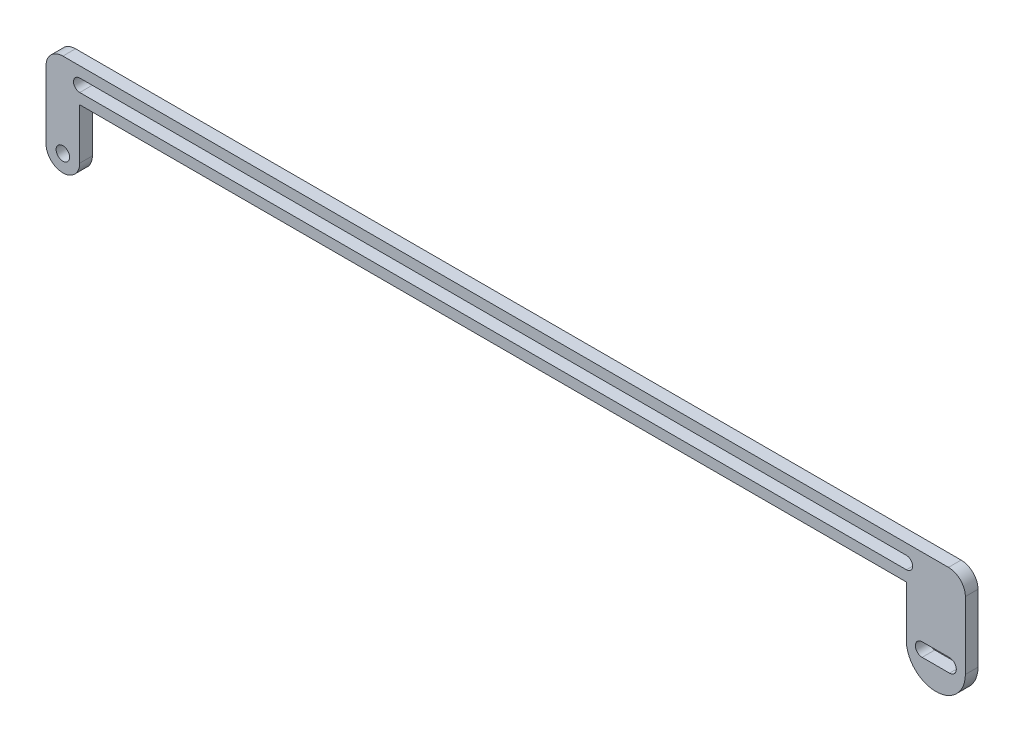
ISO-10303-21;
HEADER;
FILE_DESCRIPTION(('STEP AP214'),'2;1');
FILE_NAME('part.step','',(''),(''),'','','');
FILE_SCHEMA(('AUTOMOTIVE_DESIGN { 1 0 10303 214 1 1 1 1 }'));
ENDSEC;
DATA;
#1=APPLICATION_CONTEXT('core data for automotive mechanical design processes');
#2=APPLICATION_PROTOCOL_DEFINITION('international standard','automotive_design',2000,#1);
#3=PRODUCT_CONTEXT('',#1,'mechanical');
#4=PRODUCT('Part','Part','',(#3));
#5=PRODUCT_RELATED_PRODUCT_CATEGORY('part','',(#4));
#6=PRODUCT_DEFINITION_FORMATION('','',#4);
#7=PRODUCT_DEFINITION_CONTEXT('part definition',#1,'design');
#8=PRODUCT_DEFINITION('design','',#6,#7);
#9=PRODUCT_DEFINITION_SHAPE('','',#8);
#10=(LENGTH_UNIT() NAMED_UNIT(*) SI_UNIT(.MILLI.,.METRE.));
#11=(NAMED_UNIT(*) PLANE_ANGLE_UNIT() SI_UNIT($,.RADIAN.));
#12=(NAMED_UNIT(*) SI_UNIT($,.STERADIAN.) SOLID_ANGLE_UNIT());
#13=UNCERTAINTY_MEASURE_WITH_UNIT(LENGTH_MEASURE(1.E-05),#10,'distance_accuracy_value','');
#14=(GEOMETRIC_REPRESENTATION_CONTEXT(3) GLOBAL_UNCERTAINTY_ASSIGNED_CONTEXT((#13)) GLOBAL_UNIT_ASSIGNED_CONTEXT((#10,
#11,#12)) REPRESENTATION_CONTEXT('',''));
#15=CARTESIAN_POINT('',(0.,0.,0.));
#16=DIRECTION('',(0.,0.,1.));
#17=DIRECTION('',(1.,0.,0.));
#18=AXIS2_PLACEMENT_3D('',#15,#16,#17);
#19=CARTESIAN_POINT('',(-57.8502428277937,0.,3.));
#20=DIRECTION('',(1.,0.,0.));
#21=DIRECTION('',(0.,0.,-1.));
#22=AXIS2_PLACEMENT_3D('',#19,#20,#21);
#23=PLANE('',#22);
#24=DIRECTION('',(0.,-1.,0.));
#25=VECTOR('',#24,1.);
#26=CARTESIAN_POINT('',(-57.8502428277937,0.,0.));
#27=LINE('',#26,#25);
#28=CARTESIAN_POINT('',(-57.8502428277937,0.,0.));
#29=VERTEX_POINT('',#28);
#30=CARTESIAN_POINT('',(-57.8502428277937,-16.,0.));
#31=VERTEX_POINT('',#30);
#32=EDGE_CURVE('E220',#29,#31,#27,.T.);
#33=ORIENTED_EDGE('',*,*,#32,.T.);
#34=DIRECTION('',(0.,0.,-1.));
#35=VECTOR('',#34,1.);
#36=CARTESIAN_POINT('',(-57.8502428277937,-16.,3.));
#37=LINE('',#36,#35);
#38=CARTESIAN_POINT('',(-57.8502428277937,-16.,3.));
#39=VERTEX_POINT('',#38);
#40=EDGE_CURVE('E11',#39,#31,#37,.T.);
#41=ORIENTED_EDGE('',*,*,#40,.F.);
#42=DIRECTION('',(0.,-1.,0.));
#43=VECTOR('',#42,1.);
#44=CARTESIAN_POINT('',(-57.8502428277937,0.,3.));
#45=LINE('',#44,#43);
#46=CARTESIAN_POINT('',(-57.8502428277937,0.,3.));
#47=VERTEX_POINT('',#46);
#48=EDGE_CURVE('E382',#47,#39,#45,.T.);
#49=ORIENTED_EDGE('',*,*,#48,.F.);
#50=DIRECTION('',(0.,0.,-1.));
#51=VECTOR('',#50,1.);
#52=CARTESIAN_POINT('',(-57.8502428277937,0.,3.));
#53=LINE('',#52,#51);
#54=EDGE_CURVE('E246',#47,#29,#53,.T.);
#55=ORIENTED_EDGE('',*,*,#54,.T.);
#56=EDGE_LOOP('',(#33,#41,#49,#55));
#57=FACE_BOUND('',#56,.T.);
#58=ADVANCED_FACE('F35',(#57),#23,.F.);
#59=CARTESIAN_POINT('',(-53.8502428277937,-16.,3.));
#60=DIRECTION('',(0.,0.,-1.));
#61=DIRECTION('',(-1.,0.,0.));
#62=AXIS2_PLACEMENT_3D('',#59,#60,#61);
#63=CYLINDRICAL_SURFACE('',#62,4.);
#64=CARTESIAN_POINT('',(-53.8502428277937,-16.,0.));
#65=DIRECTION('',(0.,0.,1.));
#66=DIRECTION('',(1.,0.,0.));
#67=AXIS2_PLACEMENT_3D('',#64,#65,#66);
#68=CIRCLE('',#67,4.);
#69=CARTESIAN_POINT('',(-49.8502428277937,-16.,0.));
#70=VERTEX_POINT('',#69);
#71=EDGE_CURVE('E223',#31,#70,#68,.T.);
#72=ORIENTED_EDGE('',*,*,#71,.T.);
#73=DIRECTION('',(0.,0.,-1.));
#74=VECTOR('',#73,1.);
#75=CARTESIAN_POINT('',(-49.8502428277937,-16.,3.));
#76=LINE('',#75,#74);
#77=CARTESIAN_POINT('',(-49.8502428277937,-16.,3.));
#78=VERTEX_POINT('',#77);
#79=EDGE_CURVE('E45',#78,#70,#76,.T.);
#80=ORIENTED_EDGE('',*,*,#79,.F.);
#81=CARTESIAN_POINT('',(-53.8502428277937,-16.,3.));
#82=DIRECTION('',(0.,0.,1.));
#83=DIRECTION('',(1.,0.,0.));
#84=AXIS2_PLACEMENT_3D('',#81,#82,#83);
#85=CIRCLE('',#84,4.);
#86=EDGE_CURVE('E380',#39,#78,#85,.T.);
#87=ORIENTED_EDGE('',*,*,#86,.F.);
#88=ORIENTED_EDGE('',*,*,#40,.T.);
#89=EDGE_LOOP('',(#72,#80,#87,#88));
#90=FACE_BOUND('',#89,.T.);
#91=ADVANCED_FACE('F303',(#90),#63,.T.);
#92=CARTESIAN_POINT('',(-49.8502428277937,0.,3.));
#93=DIRECTION('',(1.,0.,0.));
#94=DIRECTION('',(0.,0.,-1.));
#95=AXIS2_PLACEMENT_3D('',#92,#93,#94);
#96=PLANE('',#95);
#97=DIRECTION('',(0.,-1.,0.));
#98=VECTOR('',#97,1.);
#99=CARTESIAN_POINT('',(-49.8502428277937,0.,0.));
#100=LINE('',#99,#98);
#101=CARTESIAN_POINT('',(-49.8502428277937,-4.,0.));
#102=VERTEX_POINT('',#101);
#103=EDGE_CURVE('E226',#102,#70,#100,.T.);
#104=ORIENTED_EDGE('',*,*,#103,.F.);
#105=DIRECTION('',(0.,0.,-1.));
#106=VECTOR('',#105,1.);
#107=CARTESIAN_POINT('',(-49.8502428277937,-4.,3.));
#108=LINE('',#107,#106);
#109=CARTESIAN_POINT('',(-49.8502428277937,-4.,3.));
#110=VERTEX_POINT('',#109);
#111=EDGE_CURVE('E257',#110,#102,#108,.T.);
#112=ORIENTED_EDGE('',*,*,#111,.F.);
#113=DIRECTION('',(0.,-1.,0.));
#114=VECTOR('',#113,1.);
#115=CARTESIAN_POINT('',(-49.8502428277937,0.,3.));
#116=LINE('',#115,#114);
#117=EDGE_CURVE('E378',#110,#78,#116,.T.);
#118=ORIENTED_EDGE('',*,*,#117,.T.);
#119=ORIENTED_EDGE('',*,*,#79,.T.);
#120=EDGE_LOOP('',(#104,#112,#118,#119));
#121=FACE_BOUND('',#120,.T.);
#122=ADVANCED_FACE('F309',(#121),#96,.T.);
#123=CARTESIAN_POINT('',(0.,-4.,3.));
#124=DIRECTION('',(0.,1.,0.));
#125=DIRECTION('',(0.,0.,1.));
#126=AXIS2_PLACEMENT_3D('',#123,#124,#125);
#127=PLANE('',#126);
#128=DIRECTION('',(1.,0.,0.));
#129=VECTOR('',#128,1.);
#130=CARTESIAN_POINT('',(0.,-4.,0.));
#131=LINE('',#130,#129);
#132=CARTESIAN_POINT('',(146.173644011722,-4.,0.));
#133=VERTEX_POINT('',#132);
#134=EDGE_CURVE('E229',#102,#133,#131,.T.);
#135=ORIENTED_EDGE('',*,*,#134,.T.);
#136=DIRECTION('',(0.,0.,-1.));
#137=VECTOR('',#136,1.);
#138=CARTESIAN_POINT('',(146.173644011722,-4.,3.));
#139=LINE('',#138,#137);
#140=CARTESIAN_POINT('',(146.173644011722,-4.,3.));
#141=VERTEX_POINT('',#140);
#142=EDGE_CURVE('E255',#141,#133,#139,.T.);
#143=ORIENTED_EDGE('',*,*,#142,.F.);
#144=DIRECTION('',(1.,0.,0.));
#145=VECTOR('',#144,1.);
#146=CARTESIAN_POINT('',(0.,-4.,3.));
#147=LINE('',#146,#145);
#148=EDGE_CURVE('E374',#110,#141,#147,.T.);
#149=ORIENTED_EDGE('',*,*,#148,.F.);
#150=ORIENTED_EDGE('',*,*,#111,.T.);
#151=EDGE_LOOP('',(#135,#143,#149,#150));
#152=FACE_BOUND('',#151,.T.);
#153=ADVANCED_FACE('F356',(#152),#127,.F.);
#154=CARTESIAN_POINT('',(146.173644011722,0.,3.));
#155=DIRECTION('',(-1.,0.,0.));
#156=DIRECTION('',(0.,0.,1.));
#157=AXIS2_PLACEMENT_3D('',#154,#155,#156);
#158=PLANE('',#157);
#159=DIRECTION('',(0.,1.,0.));
#160=VECTOR('',#159,1.);
#161=CARTESIAN_POINT('',(146.173644011722,0.,0.));
#162=LINE('',#161,#160);
#163=CARTESIAN_POINT('',(146.173644011722,-15.4960811467464,0.));
#164=VERTEX_POINT('',#163);
#165=EDGE_CURVE('E232',#164,#133,#162,.T.);
#166=ORIENTED_EDGE('',*,*,#165,.F.);
#167=DIRECTION('',(0.,0.,-1.));
#168=VECTOR('',#167,1.);
#169=CARTESIAN_POINT('',(146.173644011722,-15.4960811467464,3.));
#170=LINE('',#169,#168);
#171=CARTESIAN_POINT('',(146.173644011722,-15.4960811467464,3.));
#172=VERTEX_POINT('',#171);
#173=EDGE_CURVE('E253',#172,#164,#170,.T.);
#174=ORIENTED_EDGE('',*,*,#173,.F.);
#175=DIRECTION('',(0.,1.,0.));
#176=VECTOR('',#175,1.);
#177=CARTESIAN_POINT('',(146.173644011722,0.,3.));
#178=LINE('',#177,#176);
#179=EDGE_CURVE('E377',#172,#141,#178,.T.);
#180=ORIENTED_EDGE('',*,*,#179,.T.);
#181=ORIENTED_EDGE('',*,*,#142,.T.);
#182=EDGE_LOOP('',(#166,#174,#180,#181));
#183=FACE_BOUND('',#182,.T.);
#184=ADVANCED_FACE('F352',(#183),#158,.T.);
#185=CARTESIAN_POINT('',(153.152616012877,-16.,3.));
#186=DIRECTION('',(0.,0.,-1.));
#187=DIRECTION('',(-1.,0.,0.));
#188=AXIS2_PLACEMENT_3D('',#185,#186,#187);
#189=CYLINDRICAL_SURFACE('',#188,6.99714115932896);
#190=CARTESIAN_POINT('',(153.152616012877,-16.,0.));
#191=DIRECTION('',(0.,0.,1.));
#192=DIRECTION('',(1.,0.,0.));
#193=AXIS2_PLACEMENT_3D('',#190,#191,#192);
#194=CIRCLE('',#193,6.99714115932896);
#195=CARTESIAN_POINT('',(160.149757172206,-16.,0.));
#196=VERTEX_POINT('',#195);
#197=EDGE_CURVE('E235',#196,#164,#194,.F.);
#198=ORIENTED_EDGE('',*,*,#197,.F.);
#199=DIRECTION('',(0.,0.,-1.));
#200=VECTOR('',#199,1.);
#201=CARTESIAN_POINT('',(160.149757172206,-16.,3.));
#202=LINE('',#201,#200);
#203=CARTESIAN_POINT('',(160.149757172206,-16.,3.));
#204=VERTEX_POINT('',#203);
#205=EDGE_CURVE('E251',#204,#196,#202,.T.);
#206=ORIENTED_EDGE('',*,*,#205,.F.);
#207=CARTESIAN_POINT('',(153.152616012877,-16.,3.));
#208=DIRECTION('',(0.,0.,1.));
#209=DIRECTION('',(1.,0.,0.));
#210=AXIS2_PLACEMENT_3D('',#207,#208,#209);
#211=CIRCLE('',#210,6.99714115932896);
#212=EDGE_CURVE('E387',#204,#172,#211,.F.);
#213=ORIENTED_EDGE('',*,*,#212,.T.);
#214=ORIENTED_EDGE('',*,*,#173,.T.);
#215=EDGE_LOOP('',(#198,#206,#213,#214));
#216=FACE_BOUND('',#215,.T.);
#217=ADVANCED_FACE('F348',(#216),#189,.T.);
#218=CARTESIAN_POINT('',(160.149757172206,0.,3.));
#219=DIRECTION('',(1.,0.,0.));
#220=DIRECTION('',(0.,0.,-1.));
#221=AXIS2_PLACEMENT_3D('',#218,#219,#220);
#222=PLANE('',#221);
#223=DIRECTION('',(0.,-1.,0.));
#224=VECTOR('',#223,1.);
#225=CARTESIAN_POINT('',(160.149757172206,0.,0.));
#226=LINE('',#225,#224);
#227=CARTESIAN_POINT('',(160.149757172206,0.,0.));
#228=VERTEX_POINT('',#227);
#229=EDGE_CURVE('E238',#228,#196,#226,.T.);
#230=ORIENTED_EDGE('',*,*,#229,.F.);
#231=DIRECTION('',(0.,0.,-1.));
#232=VECTOR('',#231,1.);
#233=CARTESIAN_POINT('',(160.149757172206,0.,3.));
#234=LINE('',#233,#232);
#235=CARTESIAN_POINT('',(160.149757172206,0.,3.));
#236=VERTEX_POINT('',#235);
#237=EDGE_CURVE('E179',#236,#228,#234,.T.);
#238=ORIENTED_EDGE('',*,*,#237,.F.);
#239=DIRECTION('',(0.,-1.,0.));
#240=VECTOR('',#239,1.);
#241=CARTESIAN_POINT('',(160.149757172206,0.,3.));
#242=LINE('',#241,#240);
#243=EDGE_CURVE('E186',#236,#204,#242,.T.);
#244=ORIENTED_EDGE('',*,*,#243,.T.);
#245=ORIENTED_EDGE('',*,*,#205,.T.);
#246=EDGE_LOOP('',(#230,#238,#244,#245));
#247=FACE_BOUND('',#246,.T.);
#248=ADVANCED_FACE('F345',(#247),#222,.T.);
#249=CARTESIAN_POINT('',(156.149757172206,0.,3.));
#250=DIRECTION('',(0.,0.,-1.));
#251=DIRECTION('',(-1.,0.,0.));
#252=AXIS2_PLACEMENT_3D('',#249,#250,#251);
#253=CYLINDRICAL_SURFACE('',#252,4.);
#254=CARTESIAN_POINT('',(156.149757172206,0.,0.));
#255=DIRECTION('',(0.,0.,1.));
#256=DIRECTION('',(1.,0.,0.));
#257=AXIS2_PLACEMENT_3D('',#254,#255,#256);
#258=CIRCLE('',#257,4.);
#259=CARTESIAN_POINT('',(156.149757172206,4.,0.));
#260=VERTEX_POINT('',#259);
#261=EDGE_CURVE('E174',#260,#228,#258,.F.);
#262=ORIENTED_EDGE('',*,*,#261,.F.);
#263=DIRECTION('',(0.,0.,-1.));
#264=VECTOR('',#263,1.);
#265=CARTESIAN_POINT('',(156.149757172206,4.,3.));
#266=LINE('',#265,#264);
#267=CARTESIAN_POINT('',(156.149757172206,4.,3.));
#268=VERTEX_POINT('',#267);
#269=EDGE_CURVE('E169',#268,#260,#266,.T.);
#270=ORIENTED_EDGE('',*,*,#269,.F.);
#271=CARTESIAN_POINT('',(156.149757172206,0.,3.));
#272=DIRECTION('',(0.,0.,1.));
#273=DIRECTION('',(1.,0.,0.));
#274=AXIS2_PLACEMENT_3D('',#271,#272,#273);
#275=CIRCLE('',#274,4.);
#276=EDGE_CURVE('E172',#268,#236,#275,.F.);
#277=ORIENTED_EDGE('',*,*,#276,.T.);
#278=ORIENTED_EDGE('',*,*,#237,.T.);
#279=EDGE_LOOP('',(#262,#270,#277,#278));
#280=FACE_BOUND('',#279,.T.);
#281=ADVANCED_FACE('F171',(#280),#253,.T.);
#282=CARTESIAN_POINT('',(0.,4.,3.));
#283=DIRECTION('',(0.,1.,0.));
#284=DIRECTION('',(-1.,0.,0.));
#285=AXIS2_PLACEMENT_3D('',#282,#283,#284);
#286=PLANE('',#285);
#287=DIRECTION('',(1.,0.,0.));
#288=VECTOR('',#287,1.);
#289=CARTESIAN_POINT('',(0.,4.,0.));
#290=LINE('',#289,#288);
#291=CARTESIAN_POINT('',(-53.8502428277937,4.,0.));
#292=VERTEX_POINT('',#291);
#293=EDGE_CURVE('E242',#292,#260,#290,.T.);
#294=ORIENTED_EDGE('',*,*,#293,.F.);
#295=DIRECTION('',(0.,0.,-1.));
#296=VECTOR('',#295,1.);
#297=CARTESIAN_POINT('',(-53.8502428277937,4.,3.));
#298=LINE('',#297,#296);
#299=CARTESIAN_POINT('',(-53.8502428277937,4.,3.));
#300=VERTEX_POINT('',#299);
#301=EDGE_CURVE('E112',#300,#292,#298,.T.);
#302=ORIENTED_EDGE('',*,*,#301,.F.);
#303=DIRECTION('',(1.,0.,0.));
#304=VECTOR('',#303,1.);
#305=CARTESIAN_POINT('',(0.,4.,3.));
#306=LINE('',#305,#304);
#307=EDGE_CURVE('E183',#300,#268,#306,.T.);
#308=ORIENTED_EDGE('',*,*,#307,.T.);
#309=ORIENTED_EDGE('',*,*,#269,.T.);
#310=EDGE_LOOP('',(#294,#302,#308,#309));
#311=FACE_BOUND('',#310,.T.);
#312=ADVANCED_FACE('F188',(#311),#286,.T.);
#313=CARTESIAN_POINT('',(146.173644011722,0.,3.));
#314=DIRECTION('',(0.,0.,-1.));
#315=DIRECTION('',(-1.,0.,0.));
#316=AXIS2_PLACEMENT_3D('',#313,#314,#315);
#317=CYLINDRICAL_SURFACE('',#316,1.48347158184053);
#318=CARTESIAN_POINT('',(146.173644011722,0.,0.));
#319=DIRECTION('',(0.,0.,1.));
#320=DIRECTION('',(1.,0.,0.));
#321=AXIS2_PLACEMENT_3D('',#318,#319,#320);
#322=CIRCLE('',#321,1.48347158184053);
#323=CARTESIAN_POINT('',(146.173644011722,-1.48347158184053,0.));
#324=VERTEX_POINT('',#323);
#325=CARTESIAN_POINT('',(146.173644011722,1.48347158184053,0.));
#326=VERTEX_POINT('',#325);
#327=EDGE_CURVE('E208',#324,#326,#322,.T.);
#328=ORIENTED_EDGE('',*,*,#327,.F.);
#329=DIRECTION('',(0.,0.,-1.));
#330=VECTOR('',#329,1.);
#331=CARTESIAN_POINT('',(146.173644011722,-1.48347158184053,3.));
#332=LINE('',#331,#330);
#333=CARTESIAN_POINT('',(146.173644011722,-1.48347158184053,3.));
#334=VERTEX_POINT('',#333);
#335=EDGE_CURVE('E248',#334,#324,#332,.T.);
#336=ORIENTED_EDGE('',*,*,#335,.F.);
#337=CARTESIAN_POINT('',(146.173644011722,0.,3.));
#338=DIRECTION('',(0.,0.,1.));
#339=DIRECTION('',(1.,0.,0.));
#340=AXIS2_PLACEMENT_3D('',#337,#338,#339);
#341=CIRCLE('',#340,1.48347158184053);
#342=CARTESIAN_POINT('',(146.173644011722,1.48347158184053,3.));
#343=VERTEX_POINT('',#342);
#344=EDGE_CURVE('E402',#334,#343,#341,.T.);
#345=ORIENTED_EDGE('',*,*,#344,.T.);
#346=DIRECTION('',(0.,0.,-1.));
#347=VECTOR('',#346,1.);
#348=CARTESIAN_POINT('',(146.173644011722,1.48347158184053,3.));
#349=LINE('',#348,#347);
#350=EDGE_CURVE('E260',#343,#326,#349,.T.);
#351=ORIENTED_EDGE('',*,*,#350,.T.);
#352=EDGE_LOOP('',(#328,#336,#345,#351));
#353=FACE_BOUND('',#352,.T.);
#354=ADVANCED_FACE('F321',(#353),#317,.F.);
#355=CARTESIAN_POINT('',(0.,-1.48347158184053,3.));
#356=DIRECTION('',(0.,1.,0.));
#357=DIRECTION('',(0.,0.,1.));
#358=AXIS2_PLACEMENT_3D('',#355,#356,#357);
#359=PLANE('',#358);
#360=DIRECTION('',(1.,0.,0.));
#361=VECTOR('',#360,1.);
#362=CARTESIAN_POINT('',(0.,-1.48347158184053,0.));
#363=LINE('',#362,#361);
#364=CARTESIAN_POINT('',(-49.8502428277937,-1.48347158184053,0.));
#365=VERTEX_POINT('',#364);
#366=EDGE_CURVE('E211',#365,#324,#363,.T.);
#367=ORIENTED_EDGE('',*,*,#366,.F.);
#368=DIRECTION('',(0.,0.,-1.));
#369=VECTOR('',#368,1.);
#370=CARTESIAN_POINT('',(-49.8502428277937,-1.48347158184053,3.));
#371=LINE('',#370,#369);
#372=CARTESIAN_POINT('',(-49.8502428277937,-1.48347158184053,3.));
#373=VERTEX_POINT('',#372);
#374=EDGE_CURVE('E264',#373,#365,#371,.T.);
#375=ORIENTED_EDGE('',*,*,#374,.F.);
#376=DIRECTION('',(1.,0.,0.));
#377=VECTOR('',#376,1.);
#378=CARTESIAN_POINT('',(0.,-1.48347158184053,3.));
#379=LINE('',#378,#377);
#380=EDGE_CURVE('E399',#373,#334,#379,.T.);
#381=ORIENTED_EDGE('',*,*,#380,.T.);
#382=ORIENTED_EDGE('',*,*,#335,.T.);
#383=EDGE_LOOP('',(#367,#375,#381,#382));
#384=FACE_BOUND('',#383,.T.);
#385=ADVANCED_FACE('F317',(#384),#359,.T.);
#386=CARTESIAN_POINT('',(-49.8502428277937,0.,3.));
#387=DIRECTION('',(0.,0.,-1.));
#388=DIRECTION('',(-1.,0.,0.));
#389=AXIS2_PLACEMENT_3D('',#386,#387,#388);
#390=CYLINDRICAL_SURFACE('',#389,1.48347158184053);
#391=CARTESIAN_POINT('',(-49.8502428277937,0.,0.));
#392=DIRECTION('',(0.,0.,1.));
#393=DIRECTION('',(1.,0.,0.));
#394=AXIS2_PLACEMENT_3D('',#391,#392,#393);
#395=CIRCLE('',#394,1.48347158184053);
#396=CARTESIAN_POINT('',(-49.8502428277937,1.48347158184053,0.));
#397=VERTEX_POINT('',#396);
#398=EDGE_CURVE('E214',#397,#365,#395,.T.);
#399=ORIENTED_EDGE('',*,*,#398,.F.);
#400=DIRECTION('',(0.,0.,-1.));
#401=VECTOR('',#400,1.);
#402=CARTESIAN_POINT('',(-49.8502428277937,1.48347158184053,3.));
#403=LINE('',#402,#401);
#404=CARTESIAN_POINT('',(-49.8502428277937,1.48347158184053,3.));
#405=VERTEX_POINT('',#404);
#406=EDGE_CURVE('E262',#405,#397,#403,.T.);
#407=ORIENTED_EDGE('',*,*,#406,.F.);
#408=CARTESIAN_POINT('',(-49.8502428277937,0.,3.));
#409=DIRECTION('',(0.,0.,1.));
#410=DIRECTION('',(1.,0.,0.));
#411=AXIS2_PLACEMENT_3D('',#408,#409,#410);
#412=CIRCLE('',#411,1.48347158184053);
#413=EDGE_CURVE('E394',#405,#373,#412,.T.);
#414=ORIENTED_EDGE('',*,*,#413,.T.);
#415=ORIENTED_EDGE('',*,*,#374,.T.);
#416=EDGE_LOOP('',(#399,#407,#414,#415));
#417=FACE_BOUND('',#416,.T.);
#418=ADVANCED_FACE('F314',(#417),#390,.F.);
#419=CARTESIAN_POINT('',(149.900261055878,-16.,3.));
#420=DIRECTION('',(0.,0.,-1.));
#421=DIRECTION('',(-1.,0.,0.));
#422=AXIS2_PLACEMENT_3D('',#419,#420,#421);
#423=CYLINDRICAL_SURFACE('',#422,1.59999999999999);
#424=CARTESIAN_POINT('',(149.900261055878,-16.,0.));
#425=DIRECTION('',(0.,0.,1.));
#426=DIRECTION('',(1.,0.,0.));
#427=AXIS2_PLACEMENT_3D('',#424,#425,#426);
#428=CIRCLE('',#427,1.59999999999999);
#429=CARTESIAN_POINT('',(149.900261055878,-14.4,0.));
#430=VERTEX_POINT('',#429);
#431=CARTESIAN_POINT('',(149.900261055878,-17.6,0.));
#432=VERTEX_POINT('',#431);
#433=EDGE_CURVE('E194',#430,#432,#428,.T.);
#434=ORIENTED_EDGE('',*,*,#433,.F.);
#435=DIRECTION('',(0.,0.,-1.));
#436=VECTOR('',#435,1.);
#437=CARTESIAN_POINT('',(149.900261055878,-14.4,3.));
#438=LINE('',#437,#436);
#439=CARTESIAN_POINT('',(149.900261055878,-14.4,3.));
#440=VERTEX_POINT('',#439);
#441=EDGE_CURVE('E39',#440,#430,#438,.T.);
#442=ORIENTED_EDGE('',*,*,#441,.F.);
#443=CARTESIAN_POINT('',(149.900261055878,-16.,3.));
#444=DIRECTION('',(0.,0.,1.));
#445=DIRECTION('',(1.,0.,0.));
#446=AXIS2_PLACEMENT_3D('',#443,#444,#445);
#447=CIRCLE('',#446,1.59999999999999);
#448=CARTESIAN_POINT('',(149.900261055878,-17.6,3.));
#449=VERTEX_POINT('',#448);
#450=EDGE_CURVE('E245',#440,#449,#447,.T.);
#451=ORIENTED_EDGE('',*,*,#450,.T.);
#452=DIRECTION('',(0.,0.,-1.));
#453=VECTOR('',#452,1.);
#454=CARTESIAN_POINT('',(149.900261055878,-17.6,3.));
#455=LINE('',#454,#453);
#456=EDGE_CURVE('E190',#449,#432,#455,.T.);
#457=ORIENTED_EDGE('',*,*,#456,.T.);
#458=EDGE_LOOP('',(#434,#442,#451,#457));
#459=FACE_BOUND('',#458,.T.);
#460=ADVANCED_FACE('F37',(#459),#423,.F.);
#461=CARTESIAN_POINT('',(0.,-14.4,3.));
#462=DIRECTION('',(0.,1.,0.));
#463=DIRECTION('',(0.,0.,1.));
#464=AXIS2_PLACEMENT_3D('',#461,#462,#463);
#465=PLANE('',#464);
#466=DIRECTION('',(1.,0.,0.));
#467=VECTOR('',#466,1.);
#468=CARTESIAN_POINT('',(0.,-14.4,0.));
#469=LINE('',#468,#467);
#470=CARTESIAN_POINT('',(156.404970969876,-14.4,0.));
#471=VERTEX_POINT('',#470);
#472=EDGE_CURVE('E197',#430,#471,#469,.T.);
#473=ORIENTED_EDGE('',*,*,#472,.T.);
#474=DIRECTION('',(0.,0.,-1.));
#475=VECTOR('',#474,1.);
#476=CARTESIAN_POINT('',(156.404970969876,-14.4,3.));
#477=LINE('',#476,#475);
#478=CARTESIAN_POINT('',(156.404970969876,-14.4,3.));
#479=VERTEX_POINT('',#478);
#480=EDGE_CURVE('E269',#479,#471,#477,.T.);
#481=ORIENTED_EDGE('',*,*,#480,.F.);
#482=DIRECTION('',(1.,0.,0.));
#483=VECTOR('',#482,1.);
#484=CARTESIAN_POINT('',(0.,-14.4,3.));
#485=LINE('',#484,#483);
#486=EDGE_CURVE('E278',#440,#479,#485,.T.);
#487=ORIENTED_EDGE('',*,*,#486,.F.);
#488=ORIENTED_EDGE('',*,*,#441,.T.);
#489=EDGE_LOOP('',(#473,#481,#487,#488));
#490=FACE_BOUND('',#489,.T.);
#491=ADVANCED_FACE('F277',(#490),#465,.F.);
#492=CARTESIAN_POINT('',(156.404970969876,-16.,3.));
#493=DIRECTION('',(0.,0.,-1.));
#494=DIRECTION('',(-1.,0.,0.));
#495=AXIS2_PLACEMENT_3D('',#492,#493,#494);
#496=CYLINDRICAL_SURFACE('',#495,1.59999999999999);
#497=CARTESIAN_POINT('',(156.404970969876,-16.,0.));
#498=DIRECTION('',(0.,0.,1.));
#499=DIRECTION('',(1.,0.,0.));
#500=AXIS2_PLACEMENT_3D('',#497,#498,#499);
#501=CIRCLE('',#500,1.59999999999999);
#502=CARTESIAN_POINT('',(156.404970969876,-17.6,0.));
#503=VERTEX_POINT('',#502);
#504=EDGE_CURVE('E199',#471,#503,#501,.F.);
#505=ORIENTED_EDGE('',*,*,#504,.T.);
#506=DIRECTION('',(0.,0.,-1.));
#507=VECTOR('',#506,1.);
#508=CARTESIAN_POINT('',(156.404970969876,-17.6,3.));
#509=LINE('',#508,#507);
#510=CARTESIAN_POINT('',(156.404970969876,-17.6,3.));
#511=VERTEX_POINT('',#510);
#512=EDGE_CURVE('E268',#511,#503,#509,.T.);
#513=ORIENTED_EDGE('',*,*,#512,.F.);
#514=CARTESIAN_POINT('',(156.404970969876,-16.,3.));
#515=DIRECTION('',(0.,0.,1.));
#516=DIRECTION('',(1.,0.,0.));
#517=AXIS2_PLACEMENT_3D('',#514,#515,#516);
#518=CIRCLE('',#517,1.59999999999999);
#519=EDGE_CURVE('E409',#479,#511,#518,.F.);
#520=ORIENTED_EDGE('',*,*,#519,.F.);
#521=ORIENTED_EDGE('',*,*,#480,.T.);
#522=EDGE_LOOP('',(#505,#513,#520,#521));
#523=FACE_BOUND('',#522,.T.);
#524=ADVANCED_FACE('F290',(#523),#496,.F.);
#525=CARTESIAN_POINT('',(0.,1.48347158184053,3.));
#526=DIRECTION('',(0.,1.,0.));
#527=DIRECTION('',(0.,0.,1.));
#528=AXIS2_PLACEMENT_3D('',#525,#526,#527);
#529=PLANE('',#528);
#530=DIRECTION('',(1.,0.,0.));
#531=VECTOR('',#530,1.);
#532=CARTESIAN_POINT('',(0.,1.48347158184053,0.));
#533=LINE('',#532,#531);
#534=EDGE_CURVE('E217',#397,#326,#533,.T.);
#535=ORIENTED_EDGE('',*,*,#534,.T.);
#536=ORIENTED_EDGE('',*,*,#350,.F.);
#537=DIRECTION('',(1.,0.,0.));
#538=VECTOR('',#537,1.);
#539=CARTESIAN_POINT('',(0.,1.48347158184053,3.));
#540=LINE('',#539,#538);
#541=EDGE_CURVE('E393',#405,#343,#540,.T.);
#542=ORIENTED_EDGE('',*,*,#541,.F.);
#543=ORIENTED_EDGE('',*,*,#406,.T.);
#544=EDGE_LOOP('',(#535,#536,#542,#543));
#545=FACE_BOUND('',#544,.T.);
#546=ADVANCED_FACE('F292',(#545),#529,.F.);
#547=CARTESIAN_POINT('',(-53.8502428277937,-16.,3.));
#548=DIRECTION('',(0.,0.,-1.));
#549=DIRECTION('',(-1.,0.,0.));
#550=AXIS2_PLACEMENT_3D('',#547,#548,#549);
#551=CYLINDRICAL_SURFACE('',#550,1.6);
#552=CARTESIAN_POINT('',(-53.8502428277937,-16.,3.));
#553=DIRECTION('',(0.,0.,1.));
#554=DIRECTION('',(1.,0.,0.));
#555=AXIS2_PLACEMENT_3D('',#552,#553,#554);
#556=CIRCLE('',#555,1.6);
#557=CARTESIAN_POINT('',(-52.2502428277937,-16.,3.));
#558=VERTEX_POINT('',#557);
#559=EDGE_CURVE('E405',#558,#558,#556,.T.);
#560=ORIENTED_EDGE('',*,*,#559,.T.);
#561=EDGE_LOOP('',(#560));
#562=FACE_BOUND('',#561,.T.);
#563=CARTESIAN_POINT('',(-53.8502428277937,-16.,0.));
#564=DIRECTION('',(0.,0.,1.));
#565=DIRECTION('',(1.,0.,0.));
#566=AXIS2_PLACEMENT_3D('',#563,#564,#565);
#567=CIRCLE('',#566,1.6);
#568=CARTESIAN_POINT('',(-52.2502428277937,-16.,0.));
#569=VERTEX_POINT('',#568);
#570=EDGE_CURVE('E205',#569,#569,#567,.T.);
#571=ORIENTED_EDGE('',*,*,#570,.F.);
#572=EDGE_LOOP('',(#571));
#573=FACE_BOUND('',#572,.T.);
#574=ADVANCED_FACE('F298',(#562,#573),#551,.F.);
#575=CARTESIAN_POINT('',(0.,-17.6,3.));
#576=DIRECTION('',(0.,1.,0.));
#577=DIRECTION('',(0.,0.,1.));
#578=AXIS2_PLACEMENT_3D('',#575,#576,#577);
#579=PLANE('',#578);
#580=DIRECTION('',(1.,0.,0.));
#581=VECTOR('',#580,1.);
#582=CARTESIAN_POINT('',(0.,-17.6,0.));
#583=LINE('',#582,#581);
#584=EDGE_CURVE('E202',#432,#503,#583,.T.);
#585=ORIENTED_EDGE('',*,*,#584,.F.);
#586=ORIENTED_EDGE('',*,*,#456,.F.);
#587=DIRECTION('',(1.,0.,0.));
#588=VECTOR('',#587,1.);
#589=CARTESIAN_POINT('',(0.,-17.6,3.));
#590=LINE('',#589,#588);
#591=EDGE_CURVE('E288',#449,#511,#590,.T.);
#592=ORIENTED_EDGE('',*,*,#591,.T.);
#593=ORIENTED_EDGE('',*,*,#512,.T.);
#594=EDGE_LOOP('',(#585,#586,#592,#593));
#595=FACE_BOUND('',#594,.T.);
#596=ADVANCED_FACE('F287',(#595),#579,.T.);
#597=CARTESIAN_POINT('',(-53.8502428277937,0.,3.));
#598=DIRECTION('',(0.,0.,-1.));
#599=DIRECTION('',(-1.,0.,0.));
#600=AXIS2_PLACEMENT_3D('',#597,#598,#599);
#601=CYLINDRICAL_SURFACE('',#600,4.);
#602=CARTESIAN_POINT('',(-53.8502428277937,0.,0.));
#603=DIRECTION('',(0.,0.,1.));
#604=DIRECTION('',(1.,0.,0.));
#605=AXIS2_PLACEMENT_3D('',#602,#603,#604);
#606=CIRCLE('',#605,4.);
#607=EDGE_CURVE('E115',#292,#29,#606,.T.);
#608=ORIENTED_EDGE('',*,*,#607,.T.);
#609=ORIENTED_EDGE('',*,*,#54,.F.);
#610=CARTESIAN_POINT('',(-53.8502428277937,0.,3.));
#611=DIRECTION('',(0.,0.,1.));
#612=DIRECTION('',(1.,0.,0.));
#613=AXIS2_PLACEMENT_3D('',#610,#611,#612);
#614=CIRCLE('',#613,4.);
#615=EDGE_CURVE('E54',#300,#47,#614,.T.);
#616=ORIENTED_EDGE('',*,*,#615,.F.);
#617=ORIENTED_EDGE('',*,*,#301,.T.);
#618=EDGE_LOOP('',(#608,#609,#616,#617));
#619=FACE_BOUND('',#618,.T.);
#620=ADVANCED_FACE('F329',(#619),#601,.T.);
#621=CARTESIAN_POINT('',(0.,0.,3.));
#622=DIRECTION('',(0.,0.,1.));
#623=DIRECTION('',(1.,0.,0.));
#624=AXIS2_PLACEMENT_3D('',#621,#622,#623);
#625=PLANE('',#624);
#626=ORIENTED_EDGE('',*,*,#450,.F.);
#627=ORIENTED_EDGE('',*,*,#486,.T.);
#628=ORIENTED_EDGE('',*,*,#519,.T.);
#629=ORIENTED_EDGE('',*,*,#591,.F.);
#630=EDGE_LOOP('',(#626,#627,#628,#629));
#631=FACE_BOUND('',#630,.T.);
#632=ORIENTED_EDGE('',*,*,#559,.F.);
#633=EDGE_LOOP('',(#632));
#634=FACE_BOUND('',#633,.T.);
#635=ORIENTED_EDGE('',*,*,#344,.F.);
#636=ORIENTED_EDGE('',*,*,#380,.F.);
#637=ORIENTED_EDGE('',*,*,#413,.F.);
#638=ORIENTED_EDGE('',*,*,#541,.T.);
#639=EDGE_LOOP('',(#635,#636,#637,#638));
#640=FACE_BOUND('',#639,.T.);
#641=ORIENTED_EDGE('',*,*,#48,.T.);
#642=ORIENTED_EDGE('',*,*,#86,.T.);
#643=ORIENTED_EDGE('',*,*,#117,.F.);
#644=ORIENTED_EDGE('',*,*,#148,.T.);
#645=ORIENTED_EDGE('',*,*,#179,.F.);
#646=ORIENTED_EDGE('',*,*,#212,.F.);
#647=ORIENTED_EDGE('',*,*,#243,.F.);
#648=ORIENTED_EDGE('',*,*,#276,.F.);
#649=ORIENTED_EDGE('',*,*,#307,.F.);
#650=ORIENTED_EDGE('',*,*,#615,.T.);
#651=EDGE_LOOP('',(#641,#642,#643,#644,#645,#646,#647,#648,#649,#650));
#652=FACE_BOUND('',#651,.T.);
#653=ADVANCED_FACE('F182',(#631,#634,#640,#652),#625,.T.);
#654=CARTESIAN_POINT('',(0.,0.,0.));
#655=DIRECTION('',(0.,0.,1.));
#656=DIRECTION('',(1.,0.,0.));
#657=AXIS2_PLACEMENT_3D('',#654,#655,#656);
#658=PLANE('',#657);
#659=ORIENTED_EDGE('',*,*,#433,.T.);
#660=ORIENTED_EDGE('',*,*,#584,.T.);
#661=ORIENTED_EDGE('',*,*,#504,.F.);
#662=ORIENTED_EDGE('',*,*,#472,.F.);
#663=EDGE_LOOP('',(#659,#660,#661,#662));
#664=FACE_BOUND('',#663,.T.);
#665=ORIENTED_EDGE('',*,*,#570,.T.);
#666=EDGE_LOOP('',(#665));
#667=FACE_BOUND('',#666,.T.);
#668=ORIENTED_EDGE('',*,*,#327,.T.);
#669=ORIENTED_EDGE('',*,*,#534,.F.);
#670=ORIENTED_EDGE('',*,*,#398,.T.);
#671=ORIENTED_EDGE('',*,*,#366,.T.);
#672=EDGE_LOOP('',(#668,#669,#670,#671));
#673=FACE_BOUND('',#672,.T.);
#674=ORIENTED_EDGE('',*,*,#32,.F.);
#675=ORIENTED_EDGE('',*,*,#607,.F.);
#676=ORIENTED_EDGE('',*,*,#293,.T.);
#677=ORIENTED_EDGE('',*,*,#261,.T.);
#678=ORIENTED_EDGE('',*,*,#229,.T.);
#679=ORIENTED_EDGE('',*,*,#197,.T.);
#680=ORIENTED_EDGE('',*,*,#165,.T.);
#681=ORIENTED_EDGE('',*,*,#134,.F.);
#682=ORIENTED_EDGE('',*,*,#103,.T.);
#683=ORIENTED_EDGE('',*,*,#71,.F.);
#684=EDGE_LOOP('',(#674,#675,#676,#677,#678,#679,#680,#681,#682,#683));
#685=FACE_BOUND('',#684,.T.);
#686=ADVANCED_FACE('F281',(#664,#667,#673,#685),#658,.F.);
#687=CLOSED_SHELL('',(#58,#91,#122,#153,#184,#217,#248,#281,#312,#354,#385,#418,#460,#491,#524,
#546,#574,#596,#620,#653,#686));
#688=MANIFOLD_SOLID_BREP('B2',#687);
#689=ADVANCED_BREP_SHAPE_REPRESENTATION('',(#18,#688),#14);
#690=SHAPE_DEFINITION_REPRESENTATION(#9,#689);
ENDSEC;
END-ISO-10303-21;
